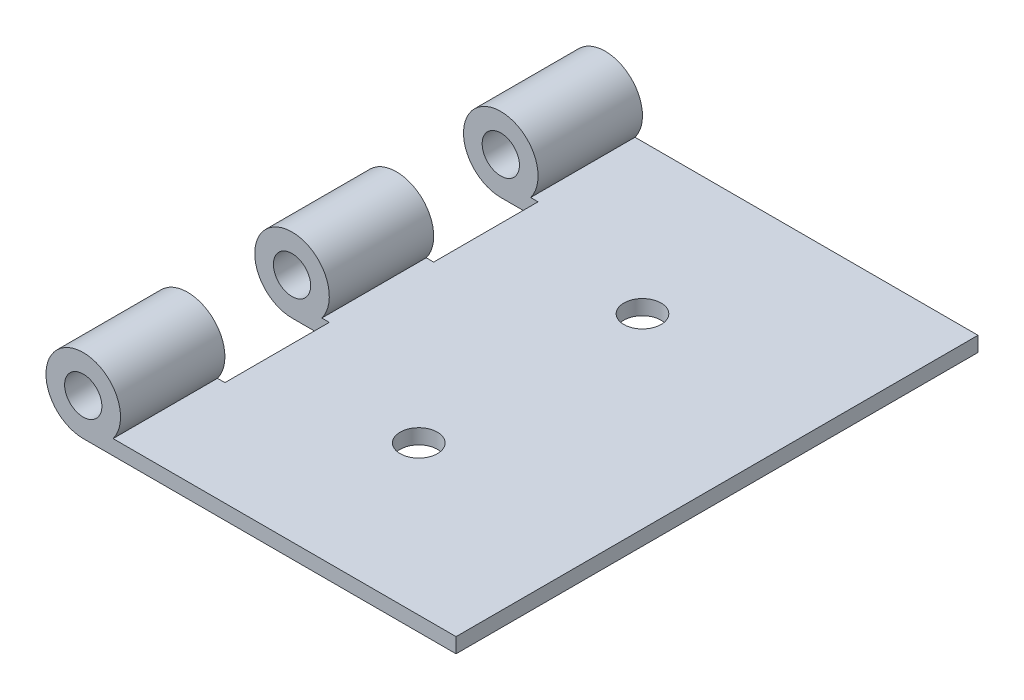
ISO-10303-21;
HEADER;
FILE_DESCRIPTION(('STEP AP214'),'2;1');
FILE_NAME('part.step','',(''),(''),'','','');
FILE_SCHEMA(('AUTOMOTIVE_DESIGN { 1 0 10303 214 1 1 1 1 }'));
ENDSEC;
DATA;
#1=APPLICATION_CONTEXT('core data for automotive mechanical design processes');
#2=APPLICATION_PROTOCOL_DEFINITION('international standard','automotive_design',2000,#1);
#3=PRODUCT_CONTEXT('',#1,'mechanical');
#4=PRODUCT('Part','Part','',(#3));
#5=PRODUCT_RELATED_PRODUCT_CATEGORY('part','',(#4));
#6=PRODUCT_DEFINITION_FORMATION('','',#4);
#7=PRODUCT_DEFINITION_CONTEXT('part definition',#1,'design');
#8=PRODUCT_DEFINITION('design','',#6,#7);
#9=PRODUCT_DEFINITION_SHAPE('','',#8);
#10=(LENGTH_UNIT() NAMED_UNIT(*) SI_UNIT(.MILLI.,.METRE.));
#11=(NAMED_UNIT(*) PLANE_ANGLE_UNIT() SI_UNIT($,.RADIAN.));
#12=(NAMED_UNIT(*) SI_UNIT($,.STERADIAN.) SOLID_ANGLE_UNIT());
#13=UNCERTAINTY_MEASURE_WITH_UNIT(LENGTH_MEASURE(1.E-05),#10,'distance_accuracy_value','');
#14=(GEOMETRIC_REPRESENTATION_CONTEXT(3) GLOBAL_UNCERTAINTY_ASSIGNED_CONTEXT((#13)) GLOBAL_UNIT_ASSIGNED_CONTEXT((#10,
#11,#12)) REPRESENTATION_CONTEXT('',''));
#15=CARTESIAN_POINT('',(0.,0.,0.));
#16=DIRECTION('',(0.,0.,1.));
#17=DIRECTION('',(1.,0.,0.));
#18=AXIS2_PLACEMENT_3D('',#15,#16,#17);
#19=CARTESIAN_POINT('',(-25.,5.,-49.142135623731));
#20=DIRECTION('',(0.,0.,1.));
#21=DIRECTION('',(1.,0.,0.));
#22=AXIS2_PLACEMENT_3D('',#19,#20,#21);
#23=CYLINDRICAL_SURFACE('',#22,5.);
#24=CARTESIAN_POINT('',(-25.,5.,21.));
#25=DIRECTION('',(0.,0.,1.));
#26=DIRECTION('',(1.,0.,0.));
#27=AXIS2_PLACEMENT_3D('',#24,#25,#26);
#28=CIRCLE('',#27,5.);
#29=CARTESIAN_POINT('',(-25.,0.,21.));
#30=VERTEX_POINT('',#29);
#31=CARTESIAN_POINT('',(-21.,2.,21.));
#32=VERTEX_POINT('',#31);
#33=EDGE_CURVE('E181',#30,#32,#28,.F.);
#34=ORIENTED_EDGE('',*,*,#33,.F.);
#35=DIRECTION('',(0.,0.,1.));
#36=VECTOR('',#35,1.);
#37=CARTESIAN_POINT('',(-25.,0.,-35.));
#38=LINE('',#37,#36);
#39=CARTESIAN_POINT('',(-25.,0.,35.));
#40=VERTEX_POINT('',#39);
#41=EDGE_CURVE('E150',#30,#40,#38,.T.);
#42=ORIENTED_EDGE('',*,*,#41,.T.);
#43=CARTESIAN_POINT('',(-25.,5.,35.));
#44=DIRECTION('',(0.,0.,1.));
#45=DIRECTION('',(1.,0.,0.));
#46=AXIS2_PLACEMENT_3D('',#43,#44,#45);
#47=CIRCLE('',#46,5.);
#48=CARTESIAN_POINT('',(-21.,2.,35.));
#49=VERTEX_POINT('',#48);
#50=EDGE_CURVE('E211',#49,#40,#47,.T.);
#51=ORIENTED_EDGE('',*,*,#50,.F.);
#52=DIRECTION('',(0.,0.,1.));
#53=VECTOR('',#52,1.);
#54=CARTESIAN_POINT('',(-21.,2.,-49.142135623731));
#55=LINE('',#54,#53);
#56=EDGE_CURVE('E50',#49,#32,#55,.F.);
#57=ORIENTED_EDGE('',*,*,#56,.T.);
#58=EDGE_LOOP('',(#34,#42,#51,#57));
#59=FACE_BOUND('',#58,.T.);
#60=ADVANCED_FACE('F33',(#59),#23,.T.);
#61=CARTESIAN_POINT('',(-25.,5.,7.00000000000001));
#62=DIRECTION('',(0.,0.,-1.));
#63=DIRECTION('',(-1.,0.,0.));
#64=AXIS2_PLACEMENT_3D('',#61,#62,#63);
#65=CIRCLE('',#64,5.);
#66=CARTESIAN_POINT('',(-21.,2.,7.00000000000001));
#67=VERTEX_POINT('',#66);
#68=CARTESIAN_POINT('',(-25.,0.,7.));
#69=VERTEX_POINT('',#68);
#70=EDGE_CURVE('E184',#67,#69,#65,.F.);
#71=ORIENTED_EDGE('',*,*,#70,.F.);
#72=CARTESIAN_POINT('',(-21.,2.,-6.99999999999999));
#73=VERTEX_POINT('',#72);
#74=EDGE_CURVE('E218',#67,#73,#55,.F.);
#75=ORIENTED_EDGE('',*,*,#74,.T.);
#76=CARTESIAN_POINT('',(-25.,5.,-6.99999999999999));
#77=DIRECTION('',(0.,0.,1.));
#78=DIRECTION('',(1.,0.,0.));
#79=AXIS2_PLACEMENT_3D('',#76,#77,#78);
#80=CIRCLE('',#79,5.);
#81=CARTESIAN_POINT('',(-25.,0.,-6.99999999999999));
#82=VERTEX_POINT('',#81);
#83=EDGE_CURVE('E171',#82,#73,#80,.F.);
#84=ORIENTED_EDGE('',*,*,#83,.F.);
#85=EDGE_CURVE('E234',#82,#69,#38,.T.);
#86=ORIENTED_EDGE('',*,*,#85,.T.);
#87=EDGE_LOOP('',(#71,#75,#84,#86));
#88=FACE_BOUND('',#87,.T.);
#89=ADVANCED_FACE('F260',(#88),#23,.T.);
#90=CARTESIAN_POINT('',(-25.,5.,-49.142135623731));
#91=DIRECTION('',(0.,0.,1.));
#92=DIRECTION('',(1.,0.,0.));
#93=AXIS2_PLACEMENT_3D('',#90,#91,#92);
#94=CYLINDRICAL_SURFACE('',#93,2.5);
#95=CARTESIAN_POINT('',(-25.,5.,-21.));
#96=DIRECTION('',(0.,0.,-1.));
#97=DIRECTION('',(-1.,0.,0.));
#98=AXIS2_PLACEMENT_3D('',#95,#96,#97);
#99=CIRCLE('',#98,2.5);
#100=CARTESIAN_POINT('',(-27.5,5.,-21.));
#101=VERTEX_POINT('',#100);
#102=EDGE_CURVE('E175',#101,#101,#99,.F.);
#103=ORIENTED_EDGE('',*,*,#102,.T.);
#104=EDGE_LOOP('',(#103));
#105=FACE_BOUND('',#104,.T.);
#106=CARTESIAN_POINT('',(-25.,5.,-35.));
#107=DIRECTION('',(0.,0.,1.));
#108=DIRECTION('',(1.,0.,0.));
#109=AXIS2_PLACEMENT_3D('',#106,#107,#108);
#110=CIRCLE('',#109,2.5);
#111=CARTESIAN_POINT('',(-22.5,5.,-35.));
#112=VERTEX_POINT('',#111);
#113=EDGE_CURVE('E208',#112,#112,#110,.F.);
#114=ORIENTED_EDGE('',*,*,#113,.T.);
#115=EDGE_LOOP('',(#114));
#116=FACE_BOUND('',#115,.T.);
#117=ADVANCED_FACE('F268',(#105,#116),#94,.F.);
#118=CARTESIAN_POINT('',(25.,2.,-35.));
#119=DIRECTION('',(-1.,0.,0.));
#120=DIRECTION('',(0.,0.,1.));
#121=AXIS2_PLACEMENT_3D('',#118,#119,#120);
#122=PLANE('',#121);
#123=DIRECTION('',(0.,0.,-1.));
#124=VECTOR('',#123,1.);
#125=CARTESIAN_POINT('',(25.,0.,-35.));
#126=LINE('',#125,#124);
#127=CARTESIAN_POINT('',(25.,0.,35.));
#128=VERTEX_POINT('',#127);
#129=CARTESIAN_POINT('',(25.,0.,-35.));
#130=VERTEX_POINT('',#129);
#131=EDGE_CURVE('E217',#128,#130,#126,.T.);
#132=ORIENTED_EDGE('',*,*,#131,.T.);
#133=DIRECTION('',(0.,-1.,0.));
#134=VECTOR('',#133,1.);
#135=CARTESIAN_POINT('',(25.,2.,-35.));
#136=LINE('',#135,#134);
#137=CARTESIAN_POINT('',(25.,2.,-35.));
#138=VERTEX_POINT('',#137);
#139=EDGE_CURVE('E11',#138,#130,#136,.T.);
#140=ORIENTED_EDGE('',*,*,#139,.F.);
#141=DIRECTION('',(0.,0.,-1.));
#142=VECTOR('',#141,1.);
#143=CARTESIAN_POINT('',(25.,2.,-35.));
#144=LINE('',#143,#142);
#145=CARTESIAN_POINT('',(25.,2.,35.));
#146=VERTEX_POINT('',#145);
#147=EDGE_CURVE('E219',#146,#138,#144,.T.);
#148=ORIENTED_EDGE('',*,*,#147,.F.);
#149=DIRECTION('',(0.,-1.,0.));
#150=VECTOR('',#149,1.);
#151=CARTESIAN_POINT('',(25.,2.,35.));
#152=LINE('',#151,#150);
#153=EDGE_CURVE('E42',#146,#128,#152,.T.);
#154=ORIENTED_EDGE('',*,*,#153,.T.);
#155=EDGE_LOOP('',(#132,#140,#148,#154));
#156=FACE_BOUND('',#155,.T.);
#157=ADVANCED_FACE('F35',(#156),#122,.F.);
#158=CARTESIAN_POINT('',(-25.,2.,-35.));
#159=DIRECTION('',(0.,0.,1.));
#160=DIRECTION('',(1.,0.,0.));
#161=AXIS2_PLACEMENT_3D('',#158,#159,#160);
#162=PLANE('',#161);
#163=DIRECTION('',(-1.,0.,0.));
#164=VECTOR('',#163,1.);
#165=CARTESIAN_POINT('',(-25.,0.,-35.));
#166=LINE('',#165,#164);
#167=CARTESIAN_POINT('',(-25.,0.,-35.));
#168=VERTEX_POINT('',#167);
#169=EDGE_CURVE('E229',#130,#168,#166,.T.);
#170=ORIENTED_EDGE('',*,*,#169,.T.);
#171=CARTESIAN_POINT('',(-25.,5.,-35.));
#172=DIRECTION('',(0.,0.,1.));
#173=DIRECTION('',(1.,0.,0.));
#174=AXIS2_PLACEMENT_3D('',#171,#172,#173);
#175=CIRCLE('',#174,5.);
#176=CARTESIAN_POINT('',(-21.,2.,-35.));
#177=VERTEX_POINT('',#176);
#178=EDGE_CURVE('E205',#168,#177,#175,.F.);
#179=ORIENTED_EDGE('',*,*,#178,.T.);
#180=DIRECTION('',(-1.,0.,0.));
#181=VECTOR('',#180,1.);
#182=CARTESIAN_POINT('',(-25.,2.,-35.));
#183=LINE('',#182,#181);
#184=EDGE_CURVE('E222',#138,#177,#183,.T.);
#185=ORIENTED_EDGE('',*,*,#184,.F.);
#186=ORIENTED_EDGE('',*,*,#139,.T.);
#187=EDGE_LOOP('',(#170,#179,#185,#186));
#188=FACE_BOUND('',#187,.T.);
#189=ORIENTED_EDGE('',*,*,#113,.F.);
#190=EDGE_LOOP('',(#189));
#191=FACE_BOUND('',#190,.T.);
#192=ADVANCED_FACE('F310',(#188,#191),#162,.F.);
#193=CARTESIAN_POINT('',(-25.,2.,35.));
#194=DIRECTION('',(0.,0.,-1.));
#195=DIRECTION('',(-1.,0.,0.));
#196=AXIS2_PLACEMENT_3D('',#193,#194,#195);
#197=PLANE('',#196);
#198=ORIENTED_EDGE('',*,*,#50,.T.);
#199=DIRECTION('',(1.,0.,0.));
#200=VECTOR('',#199,1.);
#201=CARTESIAN_POINT('',(-25.,0.,35.));
#202=LINE('',#201,#200);
#203=EDGE_CURVE('E223',#40,#128,#202,.T.);
#204=ORIENTED_EDGE('',*,*,#203,.T.);
#205=ORIENTED_EDGE('',*,*,#153,.F.);
#206=DIRECTION('',(1.,0.,0.));
#207=VECTOR('',#206,1.);
#208=CARTESIAN_POINT('',(-25.,2.,35.));
#209=LINE('',#208,#207);
#210=EDGE_CURVE('E225',#49,#146,#209,.T.);
#211=ORIENTED_EDGE('',*,*,#210,.F.);
#212=EDGE_LOOP('',(#198,#204,#205,#211));
#213=FACE_BOUND('',#212,.T.);
#214=CARTESIAN_POINT('',(-25.,5.,35.));
#215=DIRECTION('',(0.,0.,1.));
#216=DIRECTION('',(1.,0.,0.));
#217=AXIS2_PLACEMENT_3D('',#214,#215,#216);
#218=CIRCLE('',#217,2.5);
#219=CARTESIAN_POINT('',(-22.5,5.,35.));
#220=VERTEX_POINT('',#219);
#221=EDGE_CURVE('E196',#220,#220,#218,.T.);
#222=ORIENTED_EDGE('',*,*,#221,.F.);
#223=EDGE_LOOP('',(#222));
#224=FACE_BOUND('',#223,.T.);
#225=ADVANCED_FACE('F304',(#213,#224),#197,.F.);
#226=CARTESIAN_POINT('',(0.,2.,0.));
#227=DIRECTION('',(0.,1.,0.));
#228=DIRECTION('',(0.,0.,1.));
#229=AXIS2_PLACEMENT_3D('',#226,#227,#228);
#230=PLANE('',#229);
#231=DIRECTION('',(-1.,0.,0.));
#232=VECTOR('',#231,1.);
#233=CARTESIAN_POINT('',(0.,2.,7.));
#234=LINE('',#233,#232);
#235=CARTESIAN_POINT('',(-20.,2.,7.));
#236=VERTEX_POINT('',#235);
#237=EDGE_CURVE('E186',#236,#67,#234,.T.);
#238=ORIENTED_EDGE('',*,*,#237,.F.);
#239=DIRECTION('',(0.,0.,-1.));
#240=VECTOR('',#239,1.);
#241=CARTESIAN_POINT('',(-20.,2.,0.));
#242=LINE('',#241,#240);
#243=CARTESIAN_POINT('',(-20.,2.,21.));
#244=VERTEX_POINT('',#243);
#245=EDGE_CURVE('E190',#244,#236,#242,.T.);
#246=ORIENTED_EDGE('',*,*,#245,.F.);
#247=DIRECTION('',(1.,0.,0.));
#248=VECTOR('',#247,1.);
#249=CARTESIAN_POINT('',(0.,2.,21.));
#250=LINE('',#249,#248);
#251=EDGE_CURVE('E134',#32,#244,#250,.T.);
#252=ORIENTED_EDGE('',*,*,#251,.F.);
#253=ORIENTED_EDGE('',*,*,#56,.F.);
#254=ORIENTED_EDGE('',*,*,#210,.T.);
#255=ORIENTED_EDGE('',*,*,#147,.T.);
#256=ORIENTED_EDGE('',*,*,#184,.T.);
#257=CARTESIAN_POINT('',(-21.,2.,-21.));
#258=VERTEX_POINT('',#257);
#259=EDGE_CURVE('E58',#258,#177,#55,.F.);
#260=ORIENTED_EDGE('',*,*,#259,.F.);
#261=DIRECTION('',(-1.,0.,0.));
#262=VECTOR('',#261,1.);
#263=CARTESIAN_POINT('',(0.,2.,-21.));
#264=LINE('',#263,#262);
#265=CARTESIAN_POINT('',(-20.,2.,-21.));
#266=VERTEX_POINT('',#265);
#267=EDGE_CURVE('E178',#266,#258,#264,.T.);
#268=ORIENTED_EDGE('',*,*,#267,.F.);
#269=DIRECTION('',(0.,0.,-1.));
#270=VECTOR('',#269,1.);
#271=CARTESIAN_POINT('',(-20.,2.,0.));
#272=LINE('',#271,#270);
#273=CARTESIAN_POINT('',(-20.,2.,-6.99999999999999));
#274=VERTEX_POINT('',#273);
#275=EDGE_CURVE('E188',#274,#266,#272,.T.);
#276=ORIENTED_EDGE('',*,*,#275,.F.);
#277=DIRECTION('',(1.,0.,0.));
#278=VECTOR('',#277,1.);
#279=CARTESIAN_POINT('',(0.,2.,-6.99999999999999));
#280=LINE('',#279,#278);
#281=EDGE_CURVE('E173',#73,#274,#280,.T.);
#282=ORIENTED_EDGE('',*,*,#281,.F.);
#283=ORIENTED_EDGE('',*,*,#74,.F.);
#284=EDGE_LOOP('',(#238,#246,#252,#253,#254,#255,#256,#260,#268,#276,#282,#283));
#285=FACE_BOUND('',#284,.T.);
#286=CARTESIAN_POINT('',(0.,2.,-15.));
#287=DIRECTION('',(0.,1.,0.));
#288=DIRECTION('',(0.,0.,1.));
#289=AXIS2_PLACEMENT_3D('',#286,#287,#288);
#290=CIRCLE('',#289,2.5);
#291=CARTESIAN_POINT('',(0.,2.,-12.5));
#292=VERTEX_POINT('',#291);
#293=EDGE_CURVE('E197',#292,#292,#290,.T.);
#294=ORIENTED_EDGE('',*,*,#293,.F.);
#295=EDGE_LOOP('',(#294));
#296=FACE_BOUND('',#295,.T.);
#297=CARTESIAN_POINT('',(0.,2.,15.));
#298=DIRECTION('',(0.,1.,0.));
#299=DIRECTION('',(0.,0.,1.));
#300=AXIS2_PLACEMENT_3D('',#297,#298,#299);
#301=CIRCLE('',#300,2.5);
#302=CARTESIAN_POINT('',(0.,2.,17.5));
#303=VERTEX_POINT('',#302);
#304=EDGE_CURVE('E192',#303,#303,#301,.T.);
#305=ORIENTED_EDGE('',*,*,#304,.F.);
#306=EDGE_LOOP('',(#305));
#307=FACE_BOUND('',#306,.T.);
#308=ADVANCED_FACE('F278',(#285,#296,#307),#230,.T.);
#309=CARTESIAN_POINT('',(0.,0.,0.));
#310=DIRECTION('',(0.,1.,0.));
#311=DIRECTION('',(0.,0.,1.));
#312=AXIS2_PLACEMENT_3D('',#309,#310,#311);
#313=PLANE('',#312);
#314=CARTESIAN_POINT('',(0.,0.,-15.));
#315=DIRECTION('',(0.,1.,0.));
#316=DIRECTION('',(0.,0.,1.));
#317=AXIS2_PLACEMENT_3D('',#314,#315,#316);
#318=CIRCLE('',#317,2.5);
#319=CARTESIAN_POINT('',(0.,0.,-12.5));
#320=VERTEX_POINT('',#319);
#321=EDGE_CURVE('E193',#320,#320,#318,.T.);
#322=ORIENTED_EDGE('',*,*,#321,.T.);
#323=EDGE_LOOP('',(#322));
#324=FACE_BOUND('',#323,.T.);
#325=CARTESIAN_POINT('',(0.,0.,15.));
#326=DIRECTION('',(0.,1.,0.));
#327=DIRECTION('',(0.,0.,1.));
#328=AXIS2_PLACEMENT_3D('',#325,#326,#327);
#329=CIRCLE('',#328,2.5);
#330=CARTESIAN_POINT('',(0.,0.,17.5));
#331=VERTEX_POINT('',#330);
#332=EDGE_CURVE('E200',#331,#331,#329,.T.);
#333=ORIENTED_EDGE('',*,*,#332,.T.);
#334=EDGE_LOOP('',(#333));
#335=FACE_BOUND('',#334,.T.);
#336=DIRECTION('',(0.,0.,-1.));
#337=VECTOR('',#336,1.);
#338=CARTESIAN_POINT('',(-20.,0.,7.));
#339=LINE('',#338,#337);
#340=CARTESIAN_POINT('',(-20.,0.,21.));
#341=VERTEX_POINT('',#340);
#342=CARTESIAN_POINT('',(-20.,0.,7.));
#343=VERTEX_POINT('',#342);
#344=EDGE_CURVE('E141',#341,#343,#339,.T.);
#345=ORIENTED_EDGE('',*,*,#344,.T.);
#346=DIRECTION('',(-1.,0.,0.));
#347=VECTOR('',#346,1.);
#348=CARTESIAN_POINT('',(-30.,0.,7.));
#349=LINE('',#348,#347);
#350=EDGE_CURVE('E138',#343,#69,#349,.T.);
#351=ORIENTED_EDGE('',*,*,#350,.T.);
#352=ORIENTED_EDGE('',*,*,#85,.F.);
#353=DIRECTION('',(1.,0.,0.));
#354=VECTOR('',#353,1.);
#355=CARTESIAN_POINT('',(-30.,0.,-7.));
#356=LINE('',#355,#354);
#357=CARTESIAN_POINT('',(-20.,0.,-6.99999999999999));
#358=VERTEX_POINT('',#357);
#359=EDGE_CURVE('E160',#82,#358,#356,.T.);
#360=ORIENTED_EDGE('',*,*,#359,.T.);
#361=DIRECTION('',(0.,0.,-1.));
#362=VECTOR('',#361,1.);
#363=CARTESIAN_POINT('',(-20.,0.,-21.));
#364=LINE('',#363,#362);
#365=CARTESIAN_POINT('',(-20.,0.,-21.));
#366=VERTEX_POINT('',#365);
#367=EDGE_CURVE('E163',#358,#366,#364,.T.);
#368=ORIENTED_EDGE('',*,*,#367,.T.);
#369=DIRECTION('',(-1.,0.,0.));
#370=VECTOR('',#369,1.);
#371=CARTESIAN_POINT('',(-30.,0.,-21.));
#372=LINE('',#371,#370);
#373=CARTESIAN_POINT('',(-25.,0.,-21.));
#374=VERTEX_POINT('',#373);
#375=EDGE_CURVE('E166',#366,#374,#372,.T.);
#376=ORIENTED_EDGE('',*,*,#375,.T.);
#377=EDGE_CURVE('E231',#168,#374,#38,.T.);
#378=ORIENTED_EDGE('',*,*,#377,.F.);
#379=ORIENTED_EDGE('',*,*,#169,.F.);
#380=ORIENTED_EDGE('',*,*,#131,.F.);
#381=ORIENTED_EDGE('',*,*,#203,.F.);
#382=ORIENTED_EDGE('',*,*,#41,.F.);
#383=DIRECTION('',(1.,0.,0.));
#384=VECTOR('',#383,1.);
#385=CARTESIAN_POINT('',(-30.,0.,21.));
#386=LINE('',#385,#384);
#387=EDGE_CURVE('E132',#30,#341,#386,.T.);
#388=ORIENTED_EDGE('',*,*,#387,.T.);
#389=EDGE_LOOP('',(#345,#351,#352,#360,#368,#376,#378,#379,#380,#381,#382,#388));
#390=FACE_BOUND('',#389,.T.);
#391=ADVANCED_FACE('F148',(#324,#335,#390),#313,.F.);
#392=CARTESIAN_POINT('',(-25.,5.,-21.));
#393=DIRECTION('',(0.,0.,-1.));
#394=DIRECTION('',(-1.,0.,0.));
#395=AXIS2_PLACEMENT_3D('',#392,#393,#394);
#396=CIRCLE('',#395,5.);
#397=EDGE_CURVE('E176',#258,#374,#396,.F.);
#398=ORIENTED_EDGE('',*,*,#397,.F.);
#399=ORIENTED_EDGE('',*,*,#259,.T.);
#400=ORIENTED_EDGE('',*,*,#178,.F.);
#401=ORIENTED_EDGE('',*,*,#377,.T.);
#402=EDGE_LOOP('',(#398,#399,#400,#401));
#403=FACE_BOUND('',#402,.T.);
#404=ADVANCED_FACE('F263',(#403),#23,.T.);
#405=CARTESIAN_POINT('',(-25.,5.,21.));
#406=DIRECTION('',(0.,0.,1.));
#407=DIRECTION('',(1.,0.,0.));
#408=AXIS2_PLACEMENT_3D('',#405,#406,#407);
#409=CIRCLE('',#408,2.5);
#410=CARTESIAN_POINT('',(-22.5,5.,21.));
#411=VERTEX_POINT('',#410);
#412=EDGE_CURVE('E180',#411,#411,#409,.F.);
#413=ORIENTED_EDGE('',*,*,#412,.T.);
#414=EDGE_LOOP('',(#413));
#415=FACE_BOUND('',#414,.T.);
#416=ORIENTED_EDGE('',*,*,#221,.T.);
#417=EDGE_LOOP('',(#416));
#418=FACE_BOUND('',#417,.T.);
#419=ADVANCED_FACE('F244',(#415,#418),#94,.F.);
#420=CARTESIAN_POINT('',(0.,0.,15.));
#421=DIRECTION('',(0.,1.,0.));
#422=DIRECTION('',(0.,0.,1.));
#423=AXIS2_PLACEMENT_3D('',#420,#421,#422);
#424=CYLINDRICAL_SURFACE('',#423,2.5);
#425=ORIENTED_EDGE('',*,*,#332,.F.);
#426=EDGE_LOOP('',(#425));
#427=FACE_BOUND('',#426,.T.);
#428=ORIENTED_EDGE('',*,*,#304,.T.);
#429=EDGE_LOOP('',(#428));
#430=FACE_BOUND('',#429,.T.);
#431=ADVANCED_FACE('F277',(#427,#430),#424,.F.);
#432=CARTESIAN_POINT('',(0.,0.,-15.));
#433=DIRECTION('',(0.,1.,0.));
#434=DIRECTION('',(0.,0.,1.));
#435=AXIS2_PLACEMENT_3D('',#432,#433,#434);
#436=CYLINDRICAL_SURFACE('',#435,2.5);
#437=ORIENTED_EDGE('',*,*,#321,.F.);
#438=EDGE_LOOP('',(#437));
#439=FACE_BOUND('',#438,.T.);
#440=ORIENTED_EDGE('',*,*,#293,.T.);
#441=EDGE_LOOP('',(#440));
#442=FACE_BOUND('',#441,.T.);
#443=ADVANCED_FACE('F315',(#439,#442),#436,.F.);
#444=CARTESIAN_POINT('',(-30.,0.,-21.));
#445=DIRECTION('',(0.,0.,-1.));
#446=DIRECTION('',(-1.,0.,0.));
#447=AXIS2_PLACEMENT_3D('',#444,#445,#446);
#448=PLANE('',#447);
#449=ORIENTED_EDGE('',*,*,#267,.T.);
#450=ORIENTED_EDGE('',*,*,#397,.T.);
#451=ORIENTED_EDGE('',*,*,#375,.F.);
#452=DIRECTION('',(0.,1.,0.));
#453=VECTOR('',#452,1.);
#454=CARTESIAN_POINT('',(-20.,0.,-21.));
#455=LINE('',#454,#453);
#456=EDGE_CURVE('E151',#366,#266,#455,.T.);
#457=ORIENTED_EDGE('',*,*,#456,.T.);
#458=EDGE_LOOP('',(#449,#450,#451,#457));
#459=FACE_BOUND('',#458,.T.);
#460=ORIENTED_EDGE('',*,*,#102,.F.);
#461=EDGE_LOOP('',(#460));
#462=FACE_BOUND('',#461,.T.);
#463=ADVANCED_FACE('F312',(#459,#462),#448,.F.);
#464=CARTESIAN_POINT('',(-30.,0.,-7.));
#465=DIRECTION('',(0.,0.,1.));
#466=DIRECTION('',(1.,0.,0.));
#467=AXIS2_PLACEMENT_3D('',#464,#465,#466);
#468=PLANE('',#467);
#469=ORIENTED_EDGE('',*,*,#281,.T.);
#470=DIRECTION('',(0.,1.,0.));
#471=VECTOR('',#470,1.);
#472=CARTESIAN_POINT('',(-20.,0.,-6.99999999999999));
#473=LINE('',#472,#471);
#474=EDGE_CURVE('E154',#358,#274,#473,.T.);
#475=ORIENTED_EDGE('',*,*,#474,.F.);
#476=ORIENTED_EDGE('',*,*,#359,.F.);
#477=ORIENTED_EDGE('',*,*,#83,.T.);
#478=EDGE_LOOP('',(#469,#475,#476,#477));
#479=FACE_BOUND('',#478,.T.);
#480=CARTESIAN_POINT('',(-25.,5.,-6.99999999999999));
#481=DIRECTION('',(0.,0.,1.));
#482=DIRECTION('',(1.,0.,0.));
#483=AXIS2_PLACEMENT_3D('',#480,#481,#482);
#484=CIRCLE('',#483,2.5);
#485=CARTESIAN_POINT('',(-22.5,5.,-6.99999999999999));
#486=VERTEX_POINT('',#485);
#487=EDGE_CURVE('E158',#486,#486,#484,.F.);
#488=ORIENTED_EDGE('',*,*,#487,.F.);
#489=EDGE_LOOP('',(#488));
#490=FACE_BOUND('',#489,.T.);
#491=ADVANCED_FACE('F295',(#479,#490),#468,.F.);
#492=CARTESIAN_POINT('',(-20.,0.,-21.));
#493=DIRECTION('',(1.,0.,0.));
#494=DIRECTION('',(0.,0.,-1.));
#495=AXIS2_PLACEMENT_3D('',#492,#493,#494);
#496=PLANE('',#495);
#497=ORIENTED_EDGE('',*,*,#275,.T.);
#498=ORIENTED_EDGE('',*,*,#456,.F.);
#499=ORIENTED_EDGE('',*,*,#367,.F.);
#500=ORIENTED_EDGE('',*,*,#474,.T.);
#501=EDGE_LOOP('',(#497,#498,#499,#500));
#502=FACE_BOUND('',#501,.T.);
#503=ADVANCED_FACE('F255',(#502),#496,.F.);
#504=CARTESIAN_POINT('',(-30.,0.,7.));
#505=DIRECTION('',(0.,0.,-1.));
#506=DIRECTION('',(-1.,0.,0.));
#507=AXIS2_PLACEMENT_3D('',#504,#505,#506);
#508=PLANE('',#507);
#509=ORIENTED_EDGE('',*,*,#237,.T.);
#510=ORIENTED_EDGE('',*,*,#70,.T.);
#511=ORIENTED_EDGE('',*,*,#350,.F.);
#512=DIRECTION('',(0.,1.,0.));
#513=VECTOR('',#512,1.);
#514=CARTESIAN_POINT('',(-20.,0.,7.));
#515=LINE('',#514,#513);
#516=EDGE_CURVE('E137',#343,#236,#515,.T.);
#517=ORIENTED_EDGE('',*,*,#516,.T.);
#518=EDGE_LOOP('',(#509,#510,#511,#517));
#519=FACE_BOUND('',#518,.T.);
#520=CARTESIAN_POINT('',(-25.,5.,7.00000000000001));
#521=DIRECTION('',(0.,0.,-1.));
#522=DIRECTION('',(-1.,0.,0.));
#523=AXIS2_PLACEMENT_3D('',#520,#521,#522);
#524=CIRCLE('',#523,2.5);
#525=CARTESIAN_POINT('',(-27.5,5.,7.00000000000001));
#526=VERTEX_POINT('',#525);
#527=EDGE_CURVE('E37',#526,#526,#524,.F.);
#528=ORIENTED_EDGE('',*,*,#527,.F.);
#529=EDGE_LOOP('',(#528));
#530=FACE_BOUND('',#529,.T.);
#531=ADVANCED_FACE('F247',(#519,#530),#508,.F.);
#532=CARTESIAN_POINT('',(-30.,0.,21.));
#533=DIRECTION('',(0.,0.,1.));
#534=DIRECTION('',(1.,0.,0.));
#535=AXIS2_PLACEMENT_3D('',#532,#533,#534);
#536=PLANE('',#535);
#537=ORIENTED_EDGE('',*,*,#251,.T.);
#538=DIRECTION('',(0.,1.,0.));
#539=VECTOR('',#538,1.);
#540=CARTESIAN_POINT('',(-20.,0.,21.));
#541=LINE('',#540,#539);
#542=EDGE_CURVE('E127',#341,#244,#541,.T.);
#543=ORIENTED_EDGE('',*,*,#542,.F.);
#544=ORIENTED_EDGE('',*,*,#387,.F.);
#545=ORIENTED_EDGE('',*,*,#33,.T.);
#546=EDGE_LOOP('',(#537,#543,#544,#545));
#547=FACE_BOUND('',#546,.T.);
#548=ORIENTED_EDGE('',*,*,#412,.F.);
#549=EDGE_LOOP('',(#548));
#550=FACE_BOUND('',#549,.T.);
#551=ADVANCED_FACE('F129',(#547,#550),#536,.F.);
#552=CARTESIAN_POINT('',(-20.,0.,7.));
#553=DIRECTION('',(1.,0.,0.));
#554=DIRECTION('',(0.,0.,-1.));
#555=AXIS2_PLACEMENT_3D('',#552,#553,#554);
#556=PLANE('',#555);
#557=ORIENTED_EDGE('',*,*,#245,.T.);
#558=ORIENTED_EDGE('',*,*,#516,.F.);
#559=ORIENTED_EDGE('',*,*,#344,.F.);
#560=ORIENTED_EDGE('',*,*,#542,.T.);
#561=EDGE_LOOP('',(#557,#558,#559,#560));
#562=FACE_BOUND('',#561,.T.);
#563=ADVANCED_FACE('F142',(#562),#556,.F.);
#564=ORIENTED_EDGE('',*,*,#527,.T.);
#565=EDGE_LOOP('',(#564));
#566=FACE_BOUND('',#565,.T.);
#567=ORIENTED_EDGE('',*,*,#487,.T.);
#568=EDGE_LOOP('',(#567));
#569=FACE_BOUND('',#568,.T.);
#570=ADVANCED_FACE('F253',(#566,#569),#94,.F.);
#571=CLOSED_SHELL('',(#60,#89,#117,#157,#192,#225,#308,#391,#404,#419,#431,#443,#463,#491,#503,
#531,#551,#563,#570));
#572=MANIFOLD_SOLID_BREP('B2',#571);
#573=ADVANCED_BREP_SHAPE_REPRESENTATION('',(#18,#572),#14);
#574=SHAPE_DEFINITION_REPRESENTATION(#9,#573);
ENDSEC;
END-ISO-10303-21;
